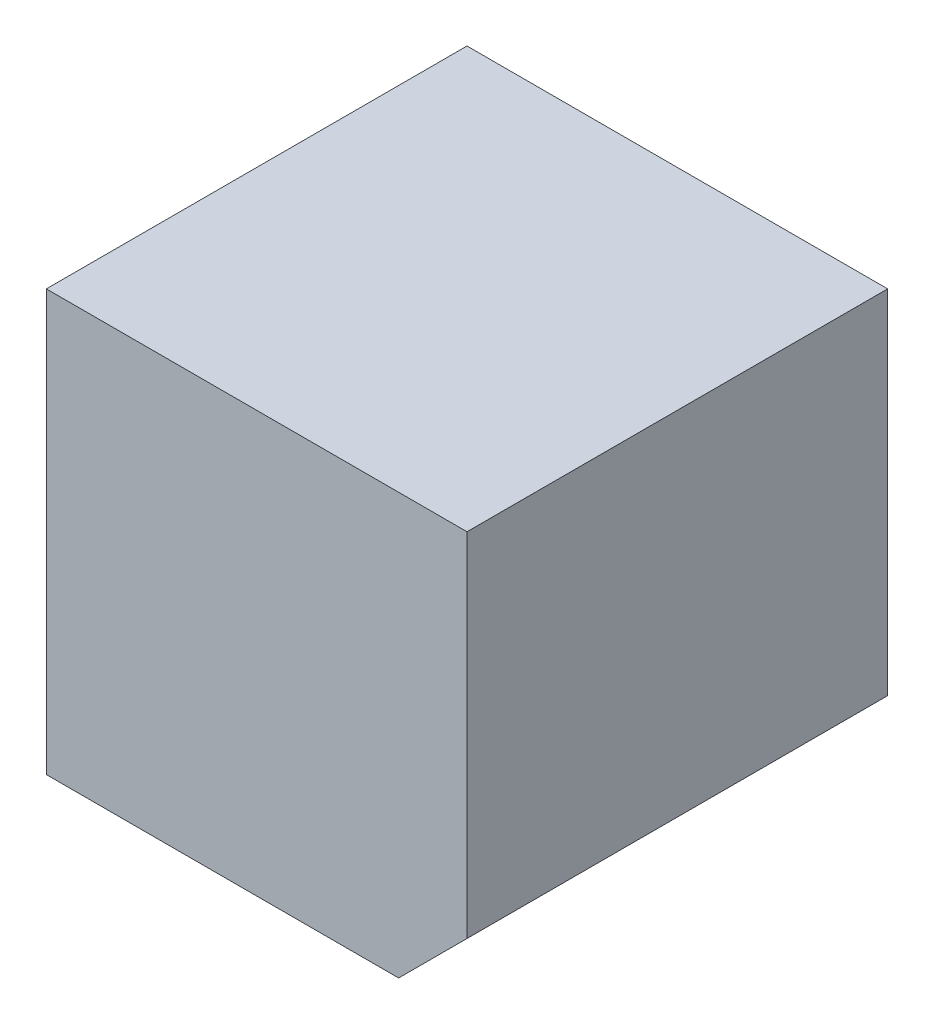
ISO-10303-21;
HEADER;
FILE_DESCRIPTION(('STEP AP214'),'2;1');
FILE_NAME('part.step','',(''),(''),'','','');
FILE_SCHEMA(('AUTOMOTIVE_DESIGN { 1 0 10303 214 1 1 1 1 }'));
ENDSEC;
DATA;
#1=APPLICATION_CONTEXT('core data for automotive mechanical design processes');
#2=APPLICATION_PROTOCOL_DEFINITION('international standard','automotive_design',2000,#1);
#3=PRODUCT_CONTEXT('',#1,'mechanical');
#4=PRODUCT('Part','Part','',(#3));
#5=PRODUCT_RELATED_PRODUCT_CATEGORY('part','',(#4));
#6=PRODUCT_DEFINITION_FORMATION('','',#4);
#7=PRODUCT_DEFINITION_CONTEXT('part definition',#1,'design');
#8=PRODUCT_DEFINITION('design','',#6,#7);
#9=PRODUCT_DEFINITION_SHAPE('','',#8);
#10=(LENGTH_UNIT() NAMED_UNIT(*) SI_UNIT(.MILLI.,.METRE.));
#11=(NAMED_UNIT(*) PLANE_ANGLE_UNIT() SI_UNIT($,.RADIAN.));
#12=(NAMED_UNIT(*) SI_UNIT($,.STERADIAN.) SOLID_ANGLE_UNIT());
#13=UNCERTAINTY_MEASURE_WITH_UNIT(LENGTH_MEASURE(1.E-05),#10,'distance_accuracy_value','');
#14=(GEOMETRIC_REPRESENTATION_CONTEXT(3) GLOBAL_UNCERTAINTY_ASSIGNED_CONTEXT((#13)) GLOBAL_UNIT_ASSIGNED_CONTEXT((#10,
#11,#12)) REPRESENTATION_CONTEXT('',''));
#15=CARTESIAN_POINT('',(0.,0.,0.));
#16=DIRECTION('',(0.,0.,1.));
#17=DIRECTION('',(1.,0.,0.));
#18=AXIS2_PLACEMENT_3D('',#15,#16,#17);
#19=CARTESIAN_POINT('',(33.5,-33.5,80.));
#20=DIRECTION('',(0.707106781186548,-0.707106781186548,0.));
#21=DIRECTION('',(0.707106781186548,0.707106781186548,0.));
#22=AXIS2_PLACEMENT_3D('',#19,#20,#21);
#23=PLANE('',#22);
#24=DIRECTION('',(-0.707106781186548,-0.707106781186548,0.));
#25=VECTOR('',#24,1.);
#26=CARTESIAN_POINT('',(33.5,-33.5,0.));
#27=LINE('',#26,#25);
#28=CARTESIAN_POINT('',(40.,-27.,0.));
#29=VERTEX_POINT('',#28);
#30=CARTESIAN_POINT('',(27.,-40.,0.));
#31=VERTEX_POINT('',#30);
#32=EDGE_CURVE('E120',#29,#31,#27,.T.);
#33=ORIENTED_EDGE('',*,*,#32,.F.);
#34=DIRECTION('',(0.,0.,-1.));
#35=VECTOR('',#34,1.);
#36=CARTESIAN_POINT('',(40.,-27.,80.));
#37=LINE('',#36,#35);
#38=CARTESIAN_POINT('',(40.,-27.,80.));
#39=VERTEX_POINT('',#38);
#40=EDGE_CURVE('E11',#39,#29,#37,.T.);
#41=ORIENTED_EDGE('',*,*,#40,.F.);
#42=DIRECTION('',(-0.707106781186548,-0.707106781186548,0.));
#43=VECTOR('',#42,1.);
#44=CARTESIAN_POINT('',(33.5,-33.5,80.));
#45=LINE('',#44,#43);
#46=CARTESIAN_POINT('',(27.,-40.,80.));
#47=VERTEX_POINT('',#46);
#48=EDGE_CURVE('E132',#39,#47,#45,.T.);
#49=ORIENTED_EDGE('',*,*,#48,.T.);
#50=DIRECTION('',(0.,0.,-1.));
#51=VECTOR('',#50,1.);
#52=CARTESIAN_POINT('',(27.,-40.,80.));
#53=LINE('',#52,#51);
#54=EDGE_CURVE('E83',#47,#31,#53,.T.);
#55=ORIENTED_EDGE('',*,*,#54,.T.);
#56=EDGE_LOOP('',(#33,#41,#49,#55));
#57=FACE_BOUND('',#56,.T.);
#58=ADVANCED_FACE('F36',(#57),#23,.T.);
#59=CARTESIAN_POINT('',(40.,0.,80.));
#60=DIRECTION('',(-1.,0.,0.));
#61=DIRECTION('',(0.,0.,1.));
#62=AXIS2_PLACEMENT_3D('',#59,#60,#61);
#63=PLANE('',#62);
#64=DIRECTION('',(0.,1.,0.));
#65=VECTOR('',#64,1.);
#66=CARTESIAN_POINT('',(40.,0.,0.));
#67=LINE('',#66,#65);
#68=CARTESIAN_POINT('',(40.,40.,0.));
#69=VERTEX_POINT('',#68);
#70=EDGE_CURVE('E123',#29,#69,#67,.T.);
#71=ORIENTED_EDGE('',*,*,#70,.T.);
#72=DIRECTION('',(0.,0.,-1.));
#73=VECTOR('',#72,1.);
#74=CARTESIAN_POINT('',(40.,40.,80.));
#75=LINE('',#74,#73);
#76=CARTESIAN_POINT('',(40.,40.,80.));
#77=VERTEX_POINT('',#76);
#78=EDGE_CURVE('E43',#77,#69,#75,.T.);
#79=ORIENTED_EDGE('',*,*,#78,.F.);
#80=DIRECTION('',(0.,1.,0.));
#81=VECTOR('',#80,1.);
#82=CARTESIAN_POINT('',(40.,0.,80.));
#83=LINE('',#82,#81);
#84=EDGE_CURVE('E112',#39,#77,#83,.T.);
#85=ORIENTED_EDGE('',*,*,#84,.F.);
#86=ORIENTED_EDGE('',*,*,#40,.T.);
#87=EDGE_LOOP('',(#71,#79,#85,#86));
#88=FACE_BOUND('',#87,.T.);
#89=ADVANCED_FACE('F136',(#88),#63,.F.);
#90=CARTESIAN_POINT('',(0.,40.,80.));
#91=DIRECTION('',(0.,1.,0.));
#92=DIRECTION('',(0.,0.,1.));
#93=AXIS2_PLACEMENT_3D('',#90,#91,#92);
#94=PLANE('',#93);
#95=DIRECTION('',(1.,0.,0.));
#96=VECTOR('',#95,1.);
#97=CARTESIAN_POINT('',(0.,40.,0.));
#98=LINE('',#97,#96);
#99=CARTESIAN_POINT('',(-40.,40.,0.));
#100=VERTEX_POINT('',#99);
#101=EDGE_CURVE('E103',#100,#69,#98,.T.);
#102=ORIENTED_EDGE('',*,*,#101,.F.);
#103=DIRECTION('',(0.,0.,-1.));
#104=VECTOR('',#103,1.);
#105=CARTESIAN_POINT('',(-40.,40.,80.));
#106=LINE('',#105,#104);
#107=CARTESIAN_POINT('',(-40.,40.,80.));
#108=VERTEX_POINT('',#107);
#109=EDGE_CURVE('E98',#108,#100,#106,.T.);
#110=ORIENTED_EDGE('',*,*,#109,.F.);
#111=DIRECTION('',(1.,0.,0.));
#112=VECTOR('',#111,1.);
#113=CARTESIAN_POINT('',(0.,40.,80.));
#114=LINE('',#113,#112);
#115=EDGE_CURVE('E101',#108,#77,#114,.T.);
#116=ORIENTED_EDGE('',*,*,#115,.T.);
#117=ORIENTED_EDGE('',*,*,#78,.T.);
#118=EDGE_LOOP('',(#102,#110,#116,#117));
#119=FACE_BOUND('',#118,.T.);
#120=ADVANCED_FACE('F100',(#119),#94,.T.);
#121=CARTESIAN_POINT('',(-40.,0.,80.));
#122=DIRECTION('',(-1.,0.,0.));
#123=DIRECTION('',(0.,0.,1.));
#124=AXIS2_PLACEMENT_3D('',#121,#122,#123);
#125=PLANE('',#124);
#126=DIRECTION('',(0.,1.,0.));
#127=VECTOR('',#126,1.);
#128=CARTESIAN_POINT('',(-40.,0.,0.));
#129=LINE('',#128,#127);
#130=CARTESIAN_POINT('',(-40.,-40.,0.));
#131=VERTEX_POINT('',#130);
#132=EDGE_CURVE('E128',#131,#100,#129,.T.);
#133=ORIENTED_EDGE('',*,*,#132,.F.);
#134=DIRECTION('',(0.,0.,-1.));
#135=VECTOR('',#134,1.);
#136=CARTESIAN_POINT('',(-40.,-40.,80.));
#137=LINE('',#136,#135);
#138=CARTESIAN_POINT('',(-40.,-40.,80.));
#139=VERTEX_POINT('',#138);
#140=EDGE_CURVE('E108',#139,#131,#137,.T.);
#141=ORIENTED_EDGE('',*,*,#140,.F.);
#142=DIRECTION('',(0.,1.,0.));
#143=VECTOR('',#142,1.);
#144=CARTESIAN_POINT('',(-40.,0.,80.));
#145=LINE('',#144,#143);
#146=EDGE_CURVE('E111',#139,#108,#145,.T.);
#147=ORIENTED_EDGE('',*,*,#146,.T.);
#148=ORIENTED_EDGE('',*,*,#109,.T.);
#149=EDGE_LOOP('',(#133,#141,#147,#148));
#150=FACE_BOUND('',#149,.T.);
#151=ADVANCED_FACE('F115',(#150),#125,.T.);
#152=CARTESIAN_POINT('',(0.,-40.,80.));
#153=DIRECTION('',(0.,1.,0.));
#154=DIRECTION('',(0.,0.,1.));
#155=AXIS2_PLACEMENT_3D('',#152,#153,#154);
#156=PLANE('',#155);
#157=DIRECTION('',(1.,0.,0.));
#158=VECTOR('',#157,1.);
#159=CARTESIAN_POINT('',(0.,-40.,0.));
#160=LINE('',#159,#158);
#161=EDGE_CURVE('E130',#131,#31,#160,.T.);
#162=ORIENTED_EDGE('',*,*,#161,.T.);
#163=ORIENTED_EDGE('',*,*,#54,.F.);
#164=DIRECTION('',(1.,0.,0.));
#165=VECTOR('',#164,1.);
#166=CARTESIAN_POINT('',(0.,-40.,80.));
#167=LINE('',#166,#165);
#168=EDGE_CURVE('E59',#139,#47,#167,.T.);
#169=ORIENTED_EDGE('',*,*,#168,.F.);
#170=ORIENTED_EDGE('',*,*,#140,.T.);
#171=EDGE_LOOP('',(#162,#163,#169,#170));
#172=FACE_BOUND('',#171,.T.);
#173=ADVANCED_FACE('F141',(#172),#156,.F.);
#174=CARTESIAN_POINT('',(0.,0.,80.));
#175=DIRECTION('',(0.,0.,1.));
#176=DIRECTION('',(1.,0.,0.));
#177=AXIS2_PLACEMENT_3D('',#174,#175,#176);
#178=PLANE('',#177);
#179=ORIENTED_EDGE('',*,*,#48,.F.);
#180=ORIENTED_EDGE('',*,*,#84,.T.);
#181=ORIENTED_EDGE('',*,*,#115,.F.);
#182=ORIENTED_EDGE('',*,*,#146,.F.);
#183=ORIENTED_EDGE('',*,*,#168,.T.);
#184=EDGE_LOOP('',(#179,#180,#181,#182,#183));
#185=FACE_BOUND('',#184,.T.);
#186=ADVANCED_FACE('F110',(#185),#178,.T.);
#187=CARTESIAN_POINT('',(0.,0.,0.));
#188=DIRECTION('',(0.,0.,1.));
#189=DIRECTION('',(1.,0.,0.));
#190=AXIS2_PLACEMENT_3D('',#187,#188,#189);
#191=PLANE('',#190);
#192=DIRECTION('',(0.,-1.,0.));
#193=VECTOR('',#192,1.);
#194=CARTESIAN_POINT('',(38.,0.,0.));
#195=LINE('',#194,#193);
#196=CARTESIAN_POINT('',(38.,38.,0.));
#197=VERTEX_POINT('',#196);
#198=CARTESIAN_POINT('',(38.,-26.1715728752538,0.));
#199=VERTEX_POINT('',#198);
#200=EDGE_CURVE('E167',#197,#199,#195,.T.);
#201=ORIENTED_EDGE('',*,*,#200,.F.);
#202=DIRECTION('',(1.,0.,0.));
#203=VECTOR('',#202,1.);
#204=CARTESIAN_POINT('',(0.,38.,0.));
#205=LINE('',#204,#203);
#206=CARTESIAN_POINT('',(-38.,38.,0.));
#207=VERTEX_POINT('',#206);
#208=EDGE_CURVE('E50',#207,#197,#205,.T.);
#209=ORIENTED_EDGE('',*,*,#208,.F.);
#210=DIRECTION('',(0.,-1.,0.));
#211=VECTOR('',#210,1.);
#212=CARTESIAN_POINT('',(-38.,0.,0.));
#213=LINE('',#212,#211);
#214=CARTESIAN_POINT('',(-38.,-38.,0.));
#215=VERTEX_POINT('',#214);
#216=EDGE_CURVE('E157',#207,#215,#213,.T.);
#217=ORIENTED_EDGE('',*,*,#216,.T.);
#218=DIRECTION('',(1.,0.,0.));
#219=VECTOR('',#218,1.);
#220=CARTESIAN_POINT('',(0.,-38.,0.));
#221=LINE('',#220,#219);
#222=CARTESIAN_POINT('',(26.1715728752538,-38.,0.));
#223=VERTEX_POINT('',#222);
#224=EDGE_CURVE('E161',#215,#223,#221,.T.);
#225=ORIENTED_EDGE('',*,*,#224,.T.);
#226=DIRECTION('',(0.707106781186547,0.707106781186548,0.));
#227=VECTOR('',#226,1.);
#228=CARTESIAN_POINT('',(32.0857864376269,-32.0857864376269,0.));
#229=LINE('',#228,#227);
#230=EDGE_CURVE('E164',#223,#199,#229,.T.);
#231=ORIENTED_EDGE('',*,*,#230,.T.);
#232=EDGE_LOOP('',(#201,#209,#217,#225,#231));
#233=FACE_BOUND('',#232,.T.);
#234=ORIENTED_EDGE('',*,*,#32,.T.);
#235=ORIENTED_EDGE('',*,*,#161,.F.);
#236=ORIENTED_EDGE('',*,*,#132,.T.);
#237=ORIENTED_EDGE('',*,*,#101,.T.);
#238=ORIENTED_EDGE('',*,*,#70,.F.);
#239=EDGE_LOOP('',(#234,#235,#236,#237,#238));
#240=FACE_BOUND('',#239,.T.);
#241=ADVANCED_FACE('F138',(#233,#240),#191,.F.);
#242=CARTESIAN_POINT('',(0.,38.,78.));
#243=DIRECTION('',(0.,1.,0.));
#244=DIRECTION('',(-1.,0.,0.));
#245=AXIS2_PLACEMENT_3D('',#242,#243,#244);
#246=PLANE('',#245);
#247=ORIENTED_EDGE('',*,*,#208,.T.);
#248=DIRECTION('',(0.,0.,-1.));
#249=VECTOR('',#248,1.);
#250=CARTESIAN_POINT('',(38.,38.,78.));
#251=LINE('',#250,#249);
#252=CARTESIAN_POINT('',(38.,38.,78.));
#253=VERTEX_POINT('',#252);
#254=EDGE_CURVE('E144',#253,#197,#251,.T.);
#255=ORIENTED_EDGE('',*,*,#254,.F.);
#256=DIRECTION('',(1.,0.,0.));
#257=VECTOR('',#256,1.);
#258=CARTESIAN_POINT('',(0.,38.,78.));
#259=LINE('',#258,#257);
#260=CARTESIAN_POINT('',(-38.,38.,78.));
#261=VERTEX_POINT('',#260);
#262=EDGE_CURVE('E160',#261,#253,#259,.T.);
#263=ORIENTED_EDGE('',*,*,#262,.F.);
#264=DIRECTION('',(0.,0.,-1.));
#265=VECTOR('',#264,1.);
#266=CARTESIAN_POINT('',(-38.,38.,78.));
#267=LINE('',#266,#265);
#268=EDGE_CURVE('E124',#261,#207,#267,.T.);
#269=ORIENTED_EDGE('',*,*,#268,.T.);
#270=EDGE_LOOP('',(#247,#255,#263,#269));
#271=FACE_BOUND('',#270,.T.);
#272=ADVANCED_FACE('F193',(#271),#246,.F.);
#273=CARTESIAN_POINT('',(-38.,0.,78.));
#274=DIRECTION('',(1.,0.,0.));
#275=DIRECTION('',(0.,1.,0.));
#276=AXIS2_PLACEMENT_3D('',#273,#274,#275);
#277=PLANE('',#276);
#278=ORIENTED_EDGE('',*,*,#216,.F.);
#279=ORIENTED_EDGE('',*,*,#268,.F.);
#280=DIRECTION('',(0.,-1.,0.));
#281=VECTOR('',#280,1.);
#282=CARTESIAN_POINT('',(-38.,0.,78.));
#283=LINE('',#282,#281);
#284=CARTESIAN_POINT('',(-38.,-38.,78.));
#285=VERTEX_POINT('',#284);
#286=EDGE_CURVE('E147',#261,#285,#283,.T.);
#287=ORIENTED_EDGE('',*,*,#286,.T.);
#288=DIRECTION('',(0.,0.,-1.));
#289=VECTOR('',#288,1.);
#290=CARTESIAN_POINT('',(-38.,-38.,78.));
#291=LINE('',#290,#289);
#292=EDGE_CURVE('E153',#285,#215,#291,.T.);
#293=ORIENTED_EDGE('',*,*,#292,.T.);
#294=EDGE_LOOP('',(#278,#279,#287,#293));
#295=FACE_BOUND('',#294,.T.);
#296=ADVANCED_FACE('F209',(#295),#277,.T.);
#297=CARTESIAN_POINT('',(0.,-38.,78.));
#298=DIRECTION('',(0.,1.,0.));
#299=DIRECTION('',(-1.,0.,0.));
#300=AXIS2_PLACEMENT_3D('',#297,#298,#299);
#301=PLANE('',#300);
#302=ORIENTED_EDGE('',*,*,#224,.F.);
#303=ORIENTED_EDGE('',*,*,#292,.F.);
#304=DIRECTION('',(1.,0.,0.));
#305=VECTOR('',#304,1.);
#306=CARTESIAN_POINT('',(0.,-38.,78.));
#307=LINE('',#306,#305);
#308=CARTESIAN_POINT('',(26.1715728752538,-38.,78.));
#309=VERTEX_POINT('',#308);
#310=EDGE_CURVE('E173',#285,#309,#307,.T.);
#311=ORIENTED_EDGE('',*,*,#310,.T.);
#312=DIRECTION('',(0.,0.,-1.));
#313=VECTOR('',#312,1.);
#314=CARTESIAN_POINT('',(26.1715728752538,-38.,78.));
#315=LINE('',#314,#313);
#316=EDGE_CURVE('E150',#309,#223,#315,.T.);
#317=ORIENTED_EDGE('',*,*,#316,.T.);
#318=EDGE_LOOP('',(#302,#303,#311,#317));
#319=FACE_BOUND('',#318,.T.);
#320=ADVANCED_FACE('F211',(#319),#301,.T.);
#321=CARTESIAN_POINT('',(32.0857864376269,-32.0857864376269,78.));
#322=DIRECTION('',(-0.707106781186548,0.707106781186547,0.));
#323=DIRECTION('',(-0.707106781186547,-0.707106781186548,0.));
#324=AXIS2_PLACEMENT_3D('',#321,#322,#323);
#325=PLANE('',#324);
#326=ORIENTED_EDGE('',*,*,#230,.F.);
#327=ORIENTED_EDGE('',*,*,#316,.F.);
#328=DIRECTION('',(0.707106781186547,0.707106781186548,0.));
#329=VECTOR('',#328,1.);
#330=CARTESIAN_POINT('',(32.0857864376269,-32.0857864376269,78.));
#331=LINE('',#330,#329);
#332=CARTESIAN_POINT('',(38.,-26.1715728752538,78.));
#333=VERTEX_POINT('',#332);
#334=EDGE_CURVE('E176',#309,#333,#331,.T.);
#335=ORIENTED_EDGE('',*,*,#334,.T.);
#336=DIRECTION('',(0.,0.,-1.));
#337=VECTOR('',#336,1.);
#338=CARTESIAN_POINT('',(38.,-26.1715728752538,78.));
#339=LINE('',#338,#337);
#340=EDGE_CURVE('E146',#333,#199,#339,.T.);
#341=ORIENTED_EDGE('',*,*,#340,.T.);
#342=EDGE_LOOP('',(#326,#327,#335,#341));
#343=FACE_BOUND('',#342,.T.);
#344=ADVANCED_FACE('F221',(#343),#325,.T.);
#345=CARTESIAN_POINT('',(38.,0.,78.));
#346=DIRECTION('',(1.,0.,0.));
#347=DIRECTION('',(0.,1.,0.));
#348=AXIS2_PLACEMENT_3D('',#345,#346,#347);
#349=PLANE('',#348);
#350=ORIENTED_EDGE('',*,*,#200,.T.);
#351=ORIENTED_EDGE('',*,*,#340,.F.);
#352=DIRECTION('',(0.,-1.,0.));
#353=VECTOR('',#352,1.);
#354=CARTESIAN_POINT('',(38.,0.,78.));
#355=LINE('',#354,#353);
#356=EDGE_CURVE('E179',#253,#333,#355,.T.);
#357=ORIENTED_EDGE('',*,*,#356,.F.);
#358=ORIENTED_EDGE('',*,*,#254,.T.);
#359=EDGE_LOOP('',(#350,#351,#357,#358));
#360=FACE_BOUND('',#359,.T.);
#361=ADVANCED_FACE('F218',(#360),#349,.F.);
#362=CARTESIAN_POINT('',(0.,0.,78.));
#363=DIRECTION('',(0.,0.,-1.));
#364=DIRECTION('',(-1.,0.,0.));
#365=AXIS2_PLACEMENT_3D('',#362,#363,#364);
#366=PLANE('',#365);
#367=ORIENTED_EDGE('',*,*,#262,.T.);
#368=ORIENTED_EDGE('',*,*,#356,.T.);
#369=ORIENTED_EDGE('',*,*,#334,.F.);
#370=ORIENTED_EDGE('',*,*,#310,.F.);
#371=ORIENTED_EDGE('',*,*,#286,.F.);
#372=EDGE_LOOP('',(#367,#368,#369,#370,#371));
#373=FACE_BOUND('',#372,.T.);
#374=ADVANCED_FACE('F187',(#373),#366,.T.);
#375=CLOSED_SHELL('',(#58,#89,#120,#151,#173,#186,#241,#272,#296,#320,#344,#361,#374));
#376=MANIFOLD_SOLID_BREP('B2',#375);
#377=ADVANCED_BREP_SHAPE_REPRESENTATION('',(#18,#376),#14);
#378=SHAPE_DEFINITION_REPRESENTATION(#9,#377);
ENDSEC;
END-ISO-10303-21;
